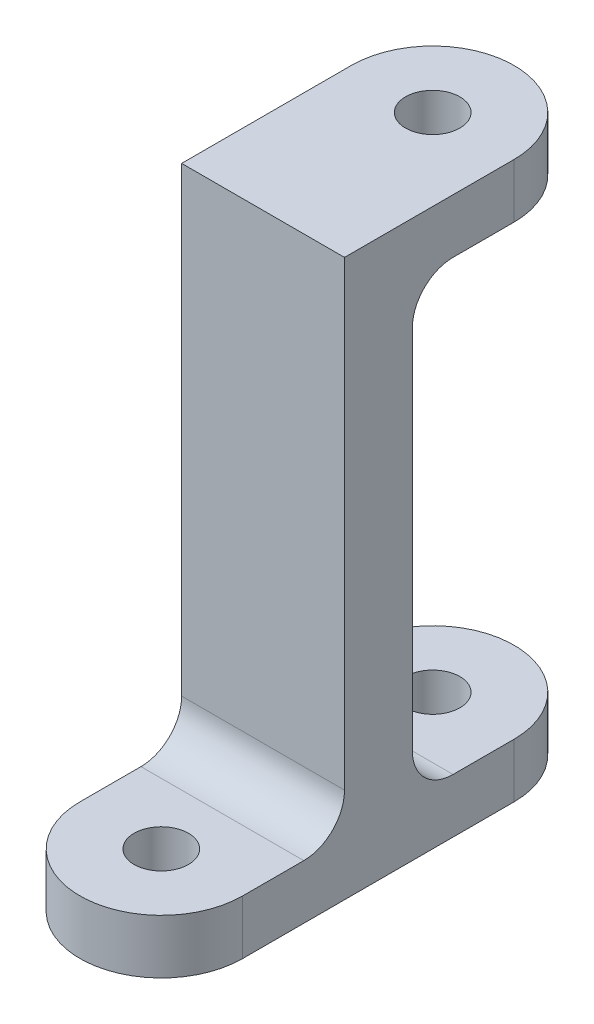
ISO-10303-21;
HEADER;
FILE_DESCRIPTION(('STEP AP214'),'2;1');
FILE_NAME('part.step','',(''),(''),'','','');
FILE_SCHEMA(('AUTOMOTIVE_DESIGN { 1 0 10303 214 1 1 1 1 }'));
ENDSEC;
DATA;
#1=APPLICATION_CONTEXT('core data for automotive mechanical design processes');
#2=APPLICATION_PROTOCOL_DEFINITION('international standard','automotive_design',2000,#1);
#3=PRODUCT_CONTEXT('',#1,'mechanical');
#4=PRODUCT('Part','Part','',(#3));
#5=PRODUCT_RELATED_PRODUCT_CATEGORY('part','',(#4));
#6=PRODUCT_DEFINITION_FORMATION('','',#4);
#7=PRODUCT_DEFINITION_CONTEXT('part definition',#1,'design');
#8=PRODUCT_DEFINITION('design','',#6,#7);
#9=PRODUCT_DEFINITION_SHAPE('','',#8);
#10=(LENGTH_UNIT() NAMED_UNIT(*) SI_UNIT(.MILLI.,.METRE.));
#11=(NAMED_UNIT(*) PLANE_ANGLE_UNIT() SI_UNIT($,.RADIAN.));
#12=(NAMED_UNIT(*) SI_UNIT($,.STERADIAN.) SOLID_ANGLE_UNIT());
#13=UNCERTAINTY_MEASURE_WITH_UNIT(LENGTH_MEASURE(1.E-05),#10,'distance_accuracy_value','');
#14=(GEOMETRIC_REPRESENTATION_CONTEXT(3) GLOBAL_UNCERTAINTY_ASSIGNED_CONTEXT((#13)) GLOBAL_UNIT_ASSIGNED_CONTEXT((#10,
#11,#12)) REPRESENTATION_CONTEXT('',''));
#15=CARTESIAN_POINT('',(0.,0.,0.));
#16=DIRECTION('',(0.,0.,1.));
#17=DIRECTION('',(1.,0.,0.));
#18=AXIS2_PLACEMENT_3D('',#15,#16,#17);
#19=CARTESIAN_POINT('',(0.,4.,0.));
#20=DIRECTION('',(0.,1.,0.));
#21=DIRECTION('',(0.,0.,1.));
#22=AXIS2_PLACEMENT_3D('',#19,#20,#21);
#23=PLANE('',#22);
#24=CARTESIAN_POINT('',(0.,4.,0.));
#25=DIRECTION('',(0.,1.,0.));
#26=DIRECTION('',(0.,0.,1.));
#27=AXIS2_PLACEMENT_3D('',#24,#25,#26);
#28=CIRCLE('',#27,2.);
#29=CARTESIAN_POINT('',(0.,4.,2.));
#30=VERTEX_POINT('',#29);
#31=EDGE_CURVE('E183',#30,#30,#28,.T.);
#32=ORIENTED_EDGE('',*,*,#31,.F.);
#33=EDGE_LOOP('',(#32));
#34=FACE_BOUND('',#33,.T.);
#35=DIRECTION('',(0.,0.,1.));
#36=VECTOR('',#35,1.);
#37=CARTESIAN_POINT('',(6.,4.,0.));
#38=LINE('',#37,#36);
#39=CARTESIAN_POINT('',(6.,4.,-4.5));
#40=VERTEX_POINT('',#39);
#41=CARTESIAN_POINT('',(6.,4.,0.));
#42=VERTEX_POINT('',#41);
#43=EDGE_CURVE('E175',#40,#42,#38,.T.);
#44=ORIENTED_EDGE('',*,*,#43,.F.);
#45=DIRECTION('',(-1.,0.,0.));
#46=VECTOR('',#45,1.);
#47=CARTESIAN_POINT('',(-6.,4.,-4.5));
#48=LINE('',#47,#46);
#49=CARTESIAN_POINT('',(-6.,4.,-4.5));
#50=VERTEX_POINT('',#49);
#51=EDGE_CURVE('E222',#40,#50,#48,.T.);
#52=ORIENTED_EDGE('',*,*,#51,.T.);
#53=DIRECTION('',(0.,0.,1.));
#54=VECTOR('',#53,1.);
#55=CARTESIAN_POINT('',(-6.,4.,0.));
#56=LINE('',#55,#54);
#57=CARTESIAN_POINT('',(-6.,4.,0.));
#58=VERTEX_POINT('',#57);
#59=EDGE_CURVE('E177',#50,#58,#56,.T.);
#60=ORIENTED_EDGE('',*,*,#59,.T.);
#61=CARTESIAN_POINT('',(0.,4.,0.));
#62=DIRECTION('',(0.,1.,0.));
#63=DIRECTION('',(0.,0.,1.));
#64=AXIS2_PLACEMENT_3D('',#61,#62,#63);
#65=CIRCLE('',#64,6.);
#66=EDGE_CURVE('E180',#58,#42,#65,.T.);
#67=ORIENTED_EDGE('',*,*,#66,.T.);
#68=EDGE_LOOP('',(#44,#52,#60,#67));
#69=FACE_BOUND('',#68,.T.);
#70=ADVANCED_FACE('F35',(#34,#69),#23,.T.);
#71=CARTESIAN_POINT('',(6.,4.,0.));
#72=DIRECTION('',(1.,0.,0.));
#73=DIRECTION('',(0.,0.,-1.));
#74=AXIS2_PLACEMENT_3D('',#71,#72,#73);
#75=PLANE('',#74);
#76=DIRECTION('',(0.,0.,1.));
#77=VECTOR('',#76,1.);
#78=CARTESIAN_POINT('',(6.,0.,0.));
#79=LINE('',#78,#77);
#80=CARTESIAN_POINT('',(6.,0.,-20.));
#81=VERTEX_POINT('',#80);
#82=CARTESIAN_POINT('',(6.,0.,0.));
#83=VERTEX_POINT('',#82);
#84=EDGE_CURVE('E167',#81,#83,#79,.T.);
#85=ORIENTED_EDGE('',*,*,#84,.F.);
#86=DIRECTION('',(0.,-1.,0.));
#87=VECTOR('',#86,1.);
#88=CARTESIAN_POINT('',(6.,4.,-20.));
#89=LINE('',#88,#87);
#90=CARTESIAN_POINT('',(6.,4.,-20.));
#91=VERTEX_POINT('',#90);
#92=EDGE_CURVE('E212',#91,#81,#89,.T.);
#93=ORIENTED_EDGE('',*,*,#92,.F.);
#94=CARTESIAN_POINT('',(6.,4.,-15.5));
#95=VERTEX_POINT('',#94);
#96=EDGE_CURVE('E172',#91,#95,#38,.T.);
#97=ORIENTED_EDGE('',*,*,#96,.T.);
#98=CARTESIAN_POINT('',(6.,7.,-15.5));
#99=DIRECTION('',(1.,0.,0.));
#100=DIRECTION('',(0.,0.,-1.));
#101=AXIS2_PLACEMENT_3D('',#98,#99,#100);
#102=CIRCLE('',#101,3.);
#103=CARTESIAN_POINT('',(6.,7.,-12.5));
#104=VERTEX_POINT('',#103);
#105=EDGE_CURVE('E11',#95,#104,#102,.F.);
#106=ORIENTED_EDGE('',*,*,#105,.T.);
#107=DIRECTION('',(0.,-1.,0.));
#108=VECTOR('',#107,1.);
#109=CARTESIAN_POINT('',(6.,37.,-12.5));
#110=LINE('',#109,#108);
#111=CARTESIAN_POINT('',(6.,34.,-12.5));
#112=VERTEX_POINT('',#111);
#113=EDGE_CURVE('E168',#112,#104,#110,.T.);
#114=ORIENTED_EDGE('',*,*,#113,.F.);
#115=CARTESIAN_POINT('',(6.,34.,-15.5));
#116=DIRECTION('',(1.,0.,0.));
#117=DIRECTION('',(0.,0.,-1.));
#118=AXIS2_PLACEMENT_3D('',#115,#116,#117);
#119=CIRCLE('',#118,3.);
#120=CARTESIAN_POINT('',(6.,37.,-15.5));
#121=VERTEX_POINT('',#120);
#122=EDGE_CURVE('E230',#112,#121,#119,.F.);
#123=ORIENTED_EDGE('',*,*,#122,.T.);
#124=DIRECTION('',(0.,0.,-1.));
#125=VECTOR('',#124,1.);
#126=CARTESIAN_POINT('',(6.,37.,0.));
#127=LINE('',#126,#125);
#128=CARTESIAN_POINT('',(6.,37.,-20.));
#129=VERTEX_POINT('',#128);
#130=EDGE_CURVE('E155',#121,#129,#127,.T.);
#131=ORIENTED_EDGE('',*,*,#130,.T.);
#132=DIRECTION('',(0.,-1.,0.));
#133=VECTOR('',#132,1.);
#134=CARTESIAN_POINT('',(6.,41.,-20.));
#135=LINE('',#134,#133);
#136=CARTESIAN_POINT('',(6.,41.,-20.));
#137=VERTEX_POINT('',#136);
#138=EDGE_CURVE('E134',#137,#129,#135,.T.);
#139=ORIENTED_EDGE('',*,*,#138,.F.);
#140=DIRECTION('',(0.,0.,-1.));
#141=VECTOR('',#140,1.);
#142=CARTESIAN_POINT('',(6.,41.,0.));
#143=LINE('',#142,#141);
#144=CARTESIAN_POINT('',(6.,41.,-7.5));
#145=VERTEX_POINT('',#144);
#146=EDGE_CURVE('E141',#145,#137,#143,.T.);
#147=ORIENTED_EDGE('',*,*,#146,.F.);
#148=DIRECTION('',(0.,-1.,0.));
#149=VECTOR('',#148,1.);
#150=CARTESIAN_POINT('',(6.,37.,-7.5));
#151=LINE('',#150,#149);
#152=CARTESIAN_POINT('',(6.,7.,-7.5));
#153=VERTEX_POINT('',#152);
#154=EDGE_CURVE('E165',#145,#153,#151,.T.);
#155=ORIENTED_EDGE('',*,*,#154,.T.);
#156=CARTESIAN_POINT('',(6.,7.,-4.5));
#157=DIRECTION('',(1.,0.,0.));
#158=DIRECTION('',(0.,0.,-1.));
#159=AXIS2_PLACEMENT_3D('',#156,#157,#158);
#160=CIRCLE('',#159,3.);
#161=EDGE_CURVE('E234',#153,#40,#160,.F.);
#162=ORIENTED_EDGE('',*,*,#161,.T.);
#163=ORIENTED_EDGE('',*,*,#43,.T.);
#164=DIRECTION('',(0.,-1.,0.));
#165=VECTOR('',#164,1.);
#166=CARTESIAN_POINT('',(6.,4.,0.));
#167=LINE('',#166,#165);
#168=EDGE_CURVE('E189',#42,#83,#167,.T.);
#169=ORIENTED_EDGE('',*,*,#168,.T.);
#170=EDGE_LOOP('',(#85,#93,#97,#106,#114,#123,#131,#139,#147,#155,#162,#163,#169));
#171=FACE_BOUND('',#170,.T.);
#172=ADVANCED_FACE('F153',(#171),#75,.T.);
#173=CARTESIAN_POINT('',(0.,4.,-20.));
#174=DIRECTION('',(0.,-1.,0.));
#175=DIRECTION('',(0.,0.,-1.));
#176=AXIS2_PLACEMENT_3D('',#173,#174,#175);
#177=CYLINDRICAL_SURFACE('',#176,6.);
#178=CARTESIAN_POINT('',(0.,0.,-20.));
#179=DIRECTION('',(0.,1.,0.));
#180=DIRECTION('',(0.,0.,1.));
#181=AXIS2_PLACEMENT_3D('',#178,#179,#180);
#182=CIRCLE('',#181,6.);
#183=CARTESIAN_POINT('',(-6.,0.,-20.));
#184=VERTEX_POINT('',#183);
#185=EDGE_CURVE('E192',#81,#184,#182,.T.);
#186=ORIENTED_EDGE('',*,*,#185,.T.);
#187=DIRECTION('',(0.,-1.,0.));
#188=VECTOR('',#187,1.);
#189=CARTESIAN_POINT('',(-6.,4.,-20.));
#190=LINE('',#189,#188);
#191=CARTESIAN_POINT('',(-6.,4.,-20.));
#192=VERTEX_POINT('',#191);
#193=EDGE_CURVE('E209',#192,#184,#190,.T.);
#194=ORIENTED_EDGE('',*,*,#193,.F.);
#195=CARTESIAN_POINT('',(0.,4.,-20.));
#196=DIRECTION('',(0.,1.,0.));
#197=DIRECTION('',(0.,0.,1.));
#198=AXIS2_PLACEMENT_3D('',#195,#196,#197);
#199=CIRCLE('',#198,6.);
#200=EDGE_CURVE('E174',#91,#192,#199,.T.);
#201=ORIENTED_EDGE('',*,*,#200,.F.);
#202=ORIENTED_EDGE('',*,*,#92,.T.);
#203=EDGE_LOOP('',(#186,#194,#201,#202));
#204=FACE_BOUND('',#203,.T.);
#205=ADVANCED_FACE('F285',(#204),#177,.T.);
#206=CARTESIAN_POINT('',(-6.,4.,0.));
#207=DIRECTION('',(1.,0.,0.));
#208=DIRECTION('',(0.,0.,-1.));
#209=AXIS2_PLACEMENT_3D('',#206,#207,#208);
#210=PLANE('',#209);
#211=DIRECTION('',(0.,0.,1.));
#212=VECTOR('',#211,1.);
#213=CARTESIAN_POINT('',(-6.,0.,0.));
#214=LINE('',#213,#212);
#215=CARTESIAN_POINT('',(-6.,0.,0.));
#216=VERTEX_POINT('',#215);
#217=EDGE_CURVE('E194',#184,#216,#214,.T.);
#218=ORIENTED_EDGE('',*,*,#217,.T.);
#219=DIRECTION('',(0.,-1.,0.));
#220=VECTOR('',#219,1.);
#221=CARTESIAN_POINT('',(-6.,4.,0.));
#222=LINE('',#221,#220);
#223=EDGE_CURVE('E206',#58,#216,#222,.T.);
#224=ORIENTED_EDGE('',*,*,#223,.F.);
#225=ORIENTED_EDGE('',*,*,#59,.F.);
#226=CARTESIAN_POINT('',(-6.,7.,-4.5));
#227=DIRECTION('',(1.,0.,0.));
#228=DIRECTION('',(0.,0.,-1.));
#229=AXIS2_PLACEMENT_3D('',#226,#227,#228);
#230=CIRCLE('',#229,3.);
#231=CARTESIAN_POINT('',(-6.,7.,-7.5));
#232=VERTEX_POINT('',#231);
#233=EDGE_CURVE('E232',#50,#232,#230,.T.);
#234=ORIENTED_EDGE('',*,*,#233,.T.);
#235=DIRECTION('',(0.,-1.,0.));
#236=VECTOR('',#235,1.);
#237=CARTESIAN_POINT('',(-6.,37.,-7.5));
#238=LINE('',#237,#236);
#239=CARTESIAN_POINT('',(-6.,41.,-7.5));
#240=VERTEX_POINT('',#239);
#241=EDGE_CURVE('E157',#240,#232,#238,.T.);
#242=ORIENTED_EDGE('',*,*,#241,.F.);
#243=DIRECTION('',(0.,0.,1.));
#244=VECTOR('',#243,1.);
#245=CARTESIAN_POINT('',(-6.,41.,0.));
#246=LINE('',#245,#244);
#247=CARTESIAN_POINT('',(-6.,41.,-20.));
#248=VERTEX_POINT('',#247);
#249=EDGE_CURVE('E140',#248,#240,#246,.T.);
#250=ORIENTED_EDGE('',*,*,#249,.F.);
#251=DIRECTION('',(0.,-1.,0.));
#252=VECTOR('',#251,1.);
#253=CARTESIAN_POINT('',(-6.,41.,-20.));
#254=LINE('',#253,#252);
#255=CARTESIAN_POINT('',(-6.,37.,-20.));
#256=VERTEX_POINT('',#255);
#257=EDGE_CURVE('E136',#248,#256,#254,.T.);
#258=ORIENTED_EDGE('',*,*,#257,.T.);
#259=DIRECTION('',(0.,0.,1.));
#260=VECTOR('',#259,1.);
#261=CARTESIAN_POINT('',(-6.,37.,0.));
#262=LINE('',#261,#260);
#263=CARTESIAN_POINT('',(-6.,37.,-15.5));
#264=VERTEX_POINT('',#263);
#265=EDGE_CURVE('E257',#256,#264,#262,.T.);
#266=ORIENTED_EDGE('',*,*,#265,.T.);
#267=CARTESIAN_POINT('',(-6.,34.,-15.5));
#268=DIRECTION('',(1.,0.,0.));
#269=DIRECTION('',(0.,0.,-1.));
#270=AXIS2_PLACEMENT_3D('',#267,#268,#269);
#271=CIRCLE('',#270,3.);
#272=CARTESIAN_POINT('',(-6.,34.,-12.5));
#273=VERTEX_POINT('',#272);
#274=EDGE_CURVE('E228',#264,#273,#271,.T.);
#275=ORIENTED_EDGE('',*,*,#274,.T.);
#276=DIRECTION('',(0.,-1.,0.));
#277=VECTOR('',#276,1.);
#278=CARTESIAN_POINT('',(-6.,37.,-12.5));
#279=LINE('',#278,#277);
#280=CARTESIAN_POINT('',(-6.,7.,-12.5));
#281=VERTEX_POINT('',#280);
#282=EDGE_CURVE('E160',#273,#281,#279,.T.);
#283=ORIENTED_EDGE('',*,*,#282,.T.);
#284=CARTESIAN_POINT('',(-6.,7.,-15.5));
#285=DIRECTION('',(1.,0.,0.));
#286=DIRECTION('',(0.,0.,-1.));
#287=AXIS2_PLACEMENT_3D('',#284,#285,#286);
#288=CIRCLE('',#287,3.);
#289=CARTESIAN_POINT('',(-6.,4.,-15.5));
#290=VERTEX_POINT('',#289);
#291=EDGE_CURVE('E43',#281,#290,#288,.T.);
#292=ORIENTED_EDGE('',*,*,#291,.T.);
#293=EDGE_CURVE('E178',#192,#290,#56,.T.);
#294=ORIENTED_EDGE('',*,*,#293,.F.);
#295=ORIENTED_EDGE('',*,*,#193,.T.);
#296=EDGE_LOOP('',(#218,#224,#225,#234,#242,#250,#258,#266,#275,#283,#292,#294,#295));
#297=FACE_BOUND('',#296,.T.);
#298=ADVANCED_FACE('F245',(#297),#210,.F.);
#299=CARTESIAN_POINT('',(0.,4.,0.));
#300=DIRECTION('',(0.,-1.,0.));
#301=DIRECTION('',(0.,0.,-1.));
#302=AXIS2_PLACEMENT_3D('',#299,#300,#301);
#303=CYLINDRICAL_SURFACE('',#302,2.);
#304=ORIENTED_EDGE('',*,*,#31,.T.);
#305=EDGE_LOOP('',(#304));
#306=FACE_BOUND('',#305,.T.);
#307=CARTESIAN_POINT('',(0.,0.,0.));
#308=DIRECTION('',(0.,1.,0.));
#309=DIRECTION('',(0.,0.,1.));
#310=AXIS2_PLACEMENT_3D('',#307,#308,#309);
#311=CIRCLE('',#310,2.);
#312=CARTESIAN_POINT('',(0.,0.,2.));
#313=VERTEX_POINT('',#312);
#314=EDGE_CURVE('E199',#313,#313,#311,.T.);
#315=ORIENTED_EDGE('',*,*,#314,.F.);
#316=EDGE_LOOP('',(#315));
#317=FACE_BOUND('',#316,.T.);
#318=ADVANCED_FACE('F376',(#306,#317),#303,.F.);
#319=CARTESIAN_POINT('',(0.,4.,0.));
#320=DIRECTION('',(0.,-1.,0.));
#321=DIRECTION('',(0.,0.,-1.));
#322=AXIS2_PLACEMENT_3D('',#319,#320,#321);
#323=CYLINDRICAL_SURFACE('',#322,6.);
#324=CARTESIAN_POINT('',(0.,0.,0.));
#325=DIRECTION('',(0.,1.,0.));
#326=DIRECTION('',(0.,0.,1.));
#327=AXIS2_PLACEMENT_3D('',#324,#325,#326);
#328=CIRCLE('',#327,6.);
#329=EDGE_CURVE('E196',#216,#83,#328,.T.);
#330=ORIENTED_EDGE('',*,*,#329,.T.);
#331=ORIENTED_EDGE('',*,*,#168,.F.);
#332=ORIENTED_EDGE('',*,*,#66,.F.);
#333=ORIENTED_EDGE('',*,*,#223,.T.);
#334=EDGE_LOOP('',(#330,#331,#332,#333));
#335=FACE_BOUND('',#334,.T.);
#336=ADVANCED_FACE('F298',(#335),#323,.T.);
#337=CARTESIAN_POINT('',(0.,4.,-20.));
#338=DIRECTION('',(0.,-1.,0.));
#339=DIRECTION('',(0.,0.,-1.));
#340=AXIS2_PLACEMENT_3D('',#337,#338,#339);
#341=CYLINDRICAL_SURFACE('',#340,2.);
#342=CARTESIAN_POINT('',(0.,4.,-20.));
#343=DIRECTION('',(0.,1.,0.));
#344=DIRECTION('',(0.,0.,1.));
#345=AXIS2_PLACEMENT_3D('',#342,#343,#344);
#346=CIRCLE('',#345,2.);
#347=CARTESIAN_POINT('',(0.,4.,-18.));
#348=VERTEX_POINT('',#347);
#349=EDGE_CURVE('E186',#348,#348,#346,.T.);
#350=ORIENTED_EDGE('',*,*,#349,.T.);
#351=EDGE_LOOP('',(#350));
#352=FACE_BOUND('',#351,.T.);
#353=CARTESIAN_POINT('',(0.,0.,-20.));
#354=DIRECTION('',(0.,1.,0.));
#355=DIRECTION('',(0.,0.,1.));
#356=AXIS2_PLACEMENT_3D('',#353,#354,#355);
#357=CIRCLE('',#356,2.);
#358=CARTESIAN_POINT('',(0.,0.,-18.));
#359=VERTEX_POINT('',#358);
#360=EDGE_CURVE('E202',#359,#359,#357,.T.);
#361=ORIENTED_EDGE('',*,*,#360,.F.);
#362=EDGE_LOOP('',(#361));
#363=FACE_BOUND('',#362,.T.);
#364=ADVANCED_FACE('F292',(#352,#363),#341,.F.);
#365=ORIENTED_EDGE('',*,*,#293,.T.);
#366=DIRECTION('',(-1.,0.,0.));
#367=VECTOR('',#366,1.);
#368=CARTESIAN_POINT('',(0.,4.,-15.5));
#369=LINE('',#368,#367);
#370=EDGE_CURVE('E56',#290,#95,#369,.F.);
#371=ORIENTED_EDGE('',*,*,#370,.T.);
#372=ORIENTED_EDGE('',*,*,#96,.F.);
#373=ORIENTED_EDGE('',*,*,#200,.T.);
#374=EDGE_LOOP('',(#365,#371,#372,#373));
#375=FACE_BOUND('',#374,.T.);
#376=ORIENTED_EDGE('',*,*,#349,.F.);
#377=EDGE_LOOP('',(#376));
#378=FACE_BOUND('',#377,.T.);
#379=ADVANCED_FACE('F281',(#375,#378),#23,.T.);
#380=CARTESIAN_POINT('',(0.,0.,0.));
#381=DIRECTION('',(0.,1.,0.));
#382=DIRECTION('',(0.,0.,1.));
#383=AXIS2_PLACEMENT_3D('',#380,#381,#382);
#384=PLANE('',#383);
#385=ORIENTED_EDGE('',*,*,#84,.T.);
#386=ORIENTED_EDGE('',*,*,#329,.F.);
#387=ORIENTED_EDGE('',*,*,#217,.F.);
#388=ORIENTED_EDGE('',*,*,#185,.F.);
#389=EDGE_LOOP('',(#385,#386,#387,#388));
#390=FACE_BOUND('',#389,.T.);
#391=ORIENTED_EDGE('',*,*,#314,.T.);
#392=EDGE_LOOP('',(#391));
#393=FACE_BOUND('',#392,.T.);
#394=ORIENTED_EDGE('',*,*,#360,.T.);
#395=EDGE_LOOP('',(#394));
#396=FACE_BOUND('',#395,.T.);
#397=ADVANCED_FACE('F291',(#390,#393,#396),#384,.F.);
#398=CARTESIAN_POINT('',(6.,37.,-7.5));
#399=DIRECTION('',(0.,0.,1.));
#400=DIRECTION('',(1.,0.,0.));
#401=AXIS2_PLACEMENT_3D('',#398,#399,#400);
#402=PLANE('',#401);
#403=ORIENTED_EDGE('',*,*,#241,.T.);
#404=DIRECTION('',(-1.,0.,0.));
#405=VECTOR('',#404,1.);
#406=CARTESIAN_POINT('',(6.,7.,-7.5));
#407=LINE('',#406,#405);
#408=EDGE_CURVE('E225',#232,#153,#407,.F.);
#409=ORIENTED_EDGE('',*,*,#408,.T.);
#410=ORIENTED_EDGE('',*,*,#154,.F.);
#411=DIRECTION('',(1.,0.,0.));
#412=VECTOR('',#411,1.);
#413=CARTESIAN_POINT('',(0.,41.,-7.5));
#414=LINE('',#413,#412);
#415=EDGE_CURVE('E147',#240,#145,#414,.T.);
#416=ORIENTED_EDGE('',*,*,#415,.F.);
#417=EDGE_LOOP('',(#403,#409,#410,#416));
#418=FACE_BOUND('',#417,.T.);
#419=ADVANCED_FACE('F248',(#418),#402,.T.);
#420=CARTESIAN_POINT('',(6.,37.,-12.5));
#421=DIRECTION('',(0.,0.,1.));
#422=DIRECTION('',(1.,0.,0.));
#423=AXIS2_PLACEMENT_3D('',#420,#421,#422);
#424=PLANE('',#423);
#425=ORIENTED_EDGE('',*,*,#282,.F.);
#426=DIRECTION('',(-1.,0.,0.));
#427=VECTOR('',#426,1.);
#428=CARTESIAN_POINT('',(6.,34.,-12.5));
#429=LINE('',#428,#427);
#430=EDGE_CURVE('E220',#273,#112,#429,.F.);
#431=ORIENTED_EDGE('',*,*,#430,.T.);
#432=ORIENTED_EDGE('',*,*,#113,.T.);
#433=DIRECTION('',(-1.,0.,0.));
#434=VECTOR('',#433,1.);
#435=CARTESIAN_POINT('',(6.,7.,-12.5));
#436=LINE('',#435,#434);
#437=EDGE_CURVE('E217',#104,#281,#436,.T.);
#438=ORIENTED_EDGE('',*,*,#437,.T.);
#439=EDGE_LOOP('',(#425,#431,#432,#438));
#440=FACE_BOUND('',#439,.T.);
#441=ADVANCED_FACE('F315',(#440),#424,.F.);
#442=CARTESIAN_POINT('',(0.,37.,0.));
#443=DIRECTION('',(0.,1.,0.));
#444=DIRECTION('',(0.,0.,1.));
#445=AXIS2_PLACEMENT_3D('',#442,#443,#444);
#446=PLANE('',#445);
#447=CARTESIAN_POINT('',(0.,37.,-20.));
#448=DIRECTION('',(0.,1.,0.));
#449=DIRECTION('',(0.,0.,1.));
#450=AXIS2_PLACEMENT_3D('',#447,#448,#449);
#451=CIRCLE('',#450,2.);
#452=CARTESIAN_POINT('',(0.,37.,-18.));
#453=VERTEX_POINT('',#452);
#454=EDGE_CURVE('E252',#453,#453,#451,.T.);
#455=ORIENTED_EDGE('',*,*,#454,.T.);
#456=EDGE_LOOP('',(#455));
#457=FACE_BOUND('',#456,.T.);
#458=ORIENTED_EDGE('',*,*,#130,.F.);
#459=DIRECTION('',(-1.,0.,0.));
#460=VECTOR('',#459,1.);
#461=CARTESIAN_POINT('',(-6.,37.,-15.5));
#462=LINE('',#461,#460);
#463=EDGE_CURVE('E214',#121,#264,#462,.T.);
#464=ORIENTED_EDGE('',*,*,#463,.T.);
#465=ORIENTED_EDGE('',*,*,#265,.F.);
#466=CARTESIAN_POINT('',(0.,37.,-20.));
#467=DIRECTION('',(0.,1.,0.));
#468=DIRECTION('',(0.,0.,1.));
#469=AXIS2_PLACEMENT_3D('',#466,#467,#468);
#470=CIRCLE('',#469,6.);
#471=EDGE_CURVE('E256',#129,#256,#470,.T.);
#472=ORIENTED_EDGE('',*,*,#471,.F.);
#473=EDGE_LOOP('',(#458,#464,#465,#472));
#474=FACE_BOUND('',#473,.T.);
#475=ADVANCED_FACE('F319',(#457,#474),#446,.F.);
#476=CARTESIAN_POINT('',(0.,41.,-20.));
#477=DIRECTION('',(0.,-1.,0.));
#478=DIRECTION('',(0.,0.,-1.));
#479=AXIS2_PLACEMENT_3D('',#476,#477,#478);
#480=CYLINDRICAL_SURFACE('',#479,6.);
#481=ORIENTED_EDGE('',*,*,#471,.T.);
#482=ORIENTED_EDGE('',*,*,#257,.F.);
#483=CARTESIAN_POINT('',(0.,41.,-20.));
#484=DIRECTION('',(0.,1.,0.));
#485=DIRECTION('',(0.,0.,1.));
#486=AXIS2_PLACEMENT_3D('',#483,#484,#485);
#487=CIRCLE('',#486,6.);
#488=EDGE_CURVE('E130',#137,#248,#487,.T.);
#489=ORIENTED_EDGE('',*,*,#488,.F.);
#490=ORIENTED_EDGE('',*,*,#138,.T.);
#491=EDGE_LOOP('',(#481,#482,#489,#490));
#492=FACE_BOUND('',#491,.T.);
#493=ADVANCED_FACE('F132',(#492),#480,.T.);
#494=CARTESIAN_POINT('',(0.,41.,-20.));
#495=DIRECTION('',(0.,-1.,0.));
#496=DIRECTION('',(0.,0.,-1.));
#497=AXIS2_PLACEMENT_3D('',#494,#495,#496);
#498=CYLINDRICAL_SURFACE('',#497,2.);
#499=CARTESIAN_POINT('',(0.,41.,-20.));
#500=DIRECTION('',(0.,1.,0.));
#501=DIRECTION('',(0.,0.,1.));
#502=AXIS2_PLACEMENT_3D('',#499,#500,#501);
#503=CIRCLE('',#502,2.);
#504=CARTESIAN_POINT('',(0.,41.,-18.));
#505=VERTEX_POINT('',#504);
#506=EDGE_CURVE('E150',#505,#505,#503,.T.);
#507=ORIENTED_EDGE('',*,*,#506,.T.);
#508=EDGE_LOOP('',(#507));
#509=FACE_BOUND('',#508,.T.);
#510=ORIENTED_EDGE('',*,*,#454,.F.);
#511=EDGE_LOOP('',(#510));
#512=FACE_BOUND('',#511,.T.);
#513=ADVANCED_FACE('F264',(#509,#512),#498,.F.);
#514=CARTESIAN_POINT('',(0.,41.,0.));
#515=DIRECTION('',(0.,1.,0.));
#516=DIRECTION('',(0.,0.,1.));
#517=AXIS2_PLACEMENT_3D('',#514,#515,#516);
#518=PLANE('',#517);
#519=ORIENTED_EDGE('',*,*,#506,.F.);
#520=EDGE_LOOP('',(#519));
#521=FACE_BOUND('',#520,.T.);
#522=ORIENTED_EDGE('',*,*,#146,.T.);
#523=ORIENTED_EDGE('',*,*,#488,.T.);
#524=ORIENTED_EDGE('',*,*,#249,.T.);
#525=ORIENTED_EDGE('',*,*,#415,.T.);
#526=EDGE_LOOP('',(#522,#523,#524,#525));
#527=FACE_BOUND('',#526,.T.);
#528=ADVANCED_FACE('F145',(#521,#527),#518,.T.);
#529=CARTESIAN_POINT('',(0.,34.,-15.5));
#530=DIRECTION('',(1.,0.,0.));
#531=DIRECTION('',(0.,0.,-1.));
#532=AXIS2_PLACEMENT_3D('',#529,#530,#531);
#533=CYLINDRICAL_SURFACE('',#532,3.);
#534=ORIENTED_EDGE('',*,*,#122,.F.);
#535=ORIENTED_EDGE('',*,*,#430,.F.);
#536=ORIENTED_EDGE('',*,*,#274,.F.);
#537=ORIENTED_EDGE('',*,*,#463,.F.);
#538=EDGE_LOOP('',(#534,#535,#536,#537));
#539=FACE_BOUND('',#538,.T.);
#540=ADVANCED_FACE('F268',(#539),#533,.F.);
#541=CARTESIAN_POINT('',(0.,7.,-4.5));
#542=DIRECTION('',(1.,0.,0.));
#543=DIRECTION('',(0.,0.,-1.));
#544=AXIS2_PLACEMENT_3D('',#541,#542,#543);
#545=CYLINDRICAL_SURFACE('',#544,3.);
#546=ORIENTED_EDGE('',*,*,#161,.F.);
#547=ORIENTED_EDGE('',*,*,#408,.F.);
#548=ORIENTED_EDGE('',*,*,#233,.F.);
#549=ORIENTED_EDGE('',*,*,#51,.F.);
#550=EDGE_LOOP('',(#546,#547,#548,#549));
#551=FACE_BOUND('',#550,.T.);
#552=ADVANCED_FACE('F244',(#551),#545,.F.);
#553=CARTESIAN_POINT('',(6.,7.,-15.5));
#554=DIRECTION('',(-1.,0.,0.));
#555=DIRECTION('',(0.,0.,1.));
#556=AXIS2_PLACEMENT_3D('',#553,#554,#555);
#557=CYLINDRICAL_SURFACE('',#556,3.);
#558=ORIENTED_EDGE('',*,*,#105,.F.);
#559=ORIENTED_EDGE('',*,*,#370,.F.);
#560=ORIENTED_EDGE('',*,*,#291,.F.);
#561=ORIENTED_EDGE('',*,*,#437,.F.);
#562=EDGE_LOOP('',(#558,#559,#560,#561));
#563=FACE_BOUND('',#562,.T.);
#564=ADVANCED_FACE('F37',(#563),#557,.F.);
#565=CLOSED_SHELL('',(#70,#172,#205,#298,#318,#336,#364,#379,#397,#419,#441,#475,#493,#513,#528,
#540,#552,#564));
#566=MANIFOLD_SOLID_BREP('B2',#565);
#567=ADVANCED_BREP_SHAPE_REPRESENTATION('',(#18,#566),#14);
#568=SHAPE_DEFINITION_REPRESENTATION(#9,#567);
ENDSEC;
END-ISO-10303-21;
